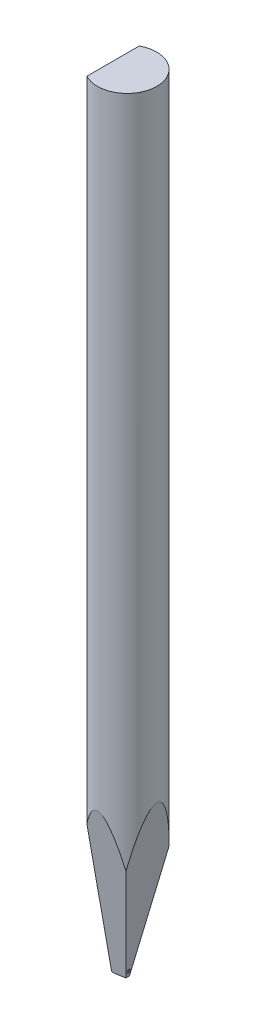
ISO-10303-21;
HEADER;
FILE_DESCRIPTION(('STEP AP214'),'2;1');
FILE_NAME('part.step','',(''),(''),'','','');
FILE_SCHEMA(('AUTOMOTIVE_DESIGN { 1 0 10303 214 1 1 1 1 }'));
ENDSEC;
DATA;
#1=APPLICATION_CONTEXT('core data for automotive mechanical design processes');
#2=APPLICATION_PROTOCOL_DEFINITION('international standard','automotive_design',2000,#1);
#3=PRODUCT_CONTEXT('',#1,'mechanical');
#4=PRODUCT('Part','Part','',(#3));
#5=PRODUCT_RELATED_PRODUCT_CATEGORY('part','',(#4));
#6=PRODUCT_DEFINITION_FORMATION('','',#4);
#7=PRODUCT_DEFINITION_CONTEXT('part definition',#1,'design');
#8=PRODUCT_DEFINITION('design','',#6,#7);
#9=PRODUCT_DEFINITION_SHAPE('','',#8);
#10=(LENGTH_UNIT() NAMED_UNIT(*) SI_UNIT(.MILLI.,.METRE.));
#11=(NAMED_UNIT(*) PLANE_ANGLE_UNIT() SI_UNIT($,.RADIAN.));
#12=(NAMED_UNIT(*) SI_UNIT($,.STERADIAN.) SOLID_ANGLE_UNIT());
#13=UNCERTAINTY_MEASURE_WITH_UNIT(LENGTH_MEASURE(1.E-05),#10,'distance_accuracy_value','');
#14=(GEOMETRIC_REPRESENTATION_CONTEXT(3) GLOBAL_UNCERTAINTY_ASSIGNED_CONTEXT((#13)) GLOBAL_UNIT_ASSIGNED_CONTEXT((#10,
#11,#12)) REPRESENTATION_CONTEXT('',''));
#15=CARTESIAN_POINT('',(0.,0.,0.));
#16=DIRECTION('',(0.,0.,1.));
#17=DIRECTION('',(1.,0.,0.));
#18=AXIS2_PLACEMENT_3D('',#15,#16,#17);
#19=CARTESIAN_POINT('',(26.8738719491216,0.,0.0381));
#20=DIRECTION('',(0.,-0.173648177666931,0.984807753012208));
#21=DIRECTION('',(0.,-0.984807753012208,-0.173648177666931));
#22=AXIS2_PLACEMENT_3D('',#19,#20,#21);
#23=PLANE('',#22);
#24=CARTESIAN_POINT('',(-0.35189,0.02413,0.0423547700444948));
#25=DIRECTION('',(0.,-0.173648177666931,0.984807753012208));
#26=DIRECTION('',(0.,-0.984807753012208,-0.173648177666931));
#27=AXIS2_PLACEMENT_3D('',#24,#25,#26);
#28=ELLIPSE('',#27,0.024502244144803,0.02413);
#29=CARTESIAN_POINT('',(-0.35189,0.,0.0380999999999996));
#30=VERTEX_POINT('',#29);
#31=CARTESIAN_POINT('',(-0.37592,0.0219354613240977,0.0419678136657259));
#32=VERTEX_POINT('',#31);
#33=EDGE_CURVE('E69',#30,#32,#28,.F.);
#34=ORIENTED_EDGE('',*,*,#33,.F.);
#35=DIRECTION('',(-1.,0.,0.));
#36=VECTOR('',#35,1.);
#37=CARTESIAN_POINT('',(26.8738719491216,0.,0.0381));
#38=LINE('',#37,#36);
#39=CARTESIAN_POINT('',(-0.279399999999996,0.,0.0381000000000001));
#40=VERTEX_POINT('',#39);
#41=EDGE_CURVE('E381',#40,#30,#38,.T.);
#42=ORIENTED_EDGE('',*,*,#41,.F.);
#43=DIRECTION('',(-0.984346441568213,-0.173566836012845,-0.0306045161452665));
#44=VECTOR('',#43,1.);
#45=CARTESIAN_POINT('',(26.0304347628768,4.6391337266767,0.856104443127717));
#46=LINE('',#45,#44);
#47=CARTESIAN_POINT('',(0.0142086463569767,0.0517711261220242,0.0472286463569738));
#48=VERTEX_POINT('',#47);
#49=EDGE_CURVE('E378',#48,#40,#46,.T.);
#50=ORIENTED_EDGE('',*,*,#49,.F.);
#51=DIRECTION('',(-0.171087869746036,-0.970287525247814,-0.171087869746036));
#52=VECTOR('',#51,1.);
#53=CARTESIAN_POINT('',(0.791557999082992,4.46033837772866,0.824577999082991));
#54=LINE('',#53,#52);
#55=CARTESIAN_POINT('',(0.543614713880756,3.05418213206493,0.576634713880755));
#56=VERTEX_POINT('',#55);
#57=EDGE_CURVE('E375',#56,#48,#54,.T.);
#58=ORIENTED_EDGE('',*,*,#57,.F.);
#59=CARTESIAN_POINT('',(0.,-0.216075837327433,0.));
#60=DIRECTION('',(0.,-0.173648177666931,0.984807753012208));
#61=DIRECTION('',(0.,-0.984807753012208,-0.173648177666931));
#62=AXIS2_PLACEMENT_3D('',#59,#60,#61);
#63=ELLIPSE('',#62,4.56371043248163,0.792479999999998);
#64=CARTESIAN_POINT('',(-0.37592,3.74046620982329,0.69764511322018));
#65=VERTEX_POINT('',#64);
#66=EDGE_CURVE('E386',#56,#65,#63,.T.);
#67=ORIENTED_EDGE('',*,*,#66,.T.);
#68=DIRECTION('',(0.,0.984807753012208,0.173648177666931));
#69=VECTOR('',#68,1.);
#70=CARTESIAN_POINT('',(-0.37592,20.2532840805181,3.60930043134861));
#71=LINE('',#70,#69);
#72=EDGE_CURVE('E54',#32,#65,#71,.T.);
#73=ORIENTED_EDGE('',*,*,#72,.F.);
#74=EDGE_LOOP('',(#34,#42,#50,#58,#67,#73));
#75=FACE_BOUND('',#74,.T.);
#76=ADVANCED_FACE('F46',(#75),#23,.T.);
#77=CARTESIAN_POINT('',(26.8738719491216,0.,-0.0381));
#78=DIRECTION('',(0.,-0.173648177666931,-0.984807753012208));
#79=DIRECTION('',(0.,0.984807753012208,-0.173648177666931));
#80=AXIS2_PLACEMENT_3D('',#77,#78,#79);
#81=PLANE('',#80);
#82=CARTESIAN_POINT('',(-0.35189,0.02413,-0.0423547700444948));
#83=DIRECTION('',(0.,-0.173648177666931,-0.984807753012208));
#84=DIRECTION('',(0.,0.984807753012208,-0.173648177666931));
#85=AXIS2_PLACEMENT_3D('',#82,#83,#84);
#86=ELLIPSE('',#85,0.024502244144803,0.02413);
#87=CARTESIAN_POINT('',(-0.37592,0.0219354613240977,-0.0419678136657255));
#88=VERTEX_POINT('',#87);
#89=CARTESIAN_POINT('',(-0.35189,0.,-0.0380999999999996));
#90=VERTEX_POINT('',#89);
#91=EDGE_CURVE('E182',#88,#90,#86,.F.);
#92=ORIENTED_EDGE('',*,*,#91,.F.);
#93=DIRECTION('',(0.,-0.984807753012208,0.173648177666931));
#94=VECTOR('',#93,1.);
#95=CARTESIAN_POINT('',(-0.37592,20.5277483982937,-3.65769589581418));
#96=LINE('',#95,#94);
#97=CARTESIAN_POINT('',(-0.37592,3.74046620982329,-0.69764511322018));
#98=VERTEX_POINT('',#97);
#99=EDGE_CURVE('E178',#98,#88,#96,.T.);
#100=ORIENTED_EDGE('',*,*,#99,.F.);
#101=CARTESIAN_POINT('',(0.,-0.216075837327433,0.));
#102=DIRECTION('',(0.,-0.173648177666931,-0.984807753012208));
#103=DIRECTION('',(0.,-0.984807753012208,0.173648177666931));
#104=AXIS2_PLACEMENT_3D('',#101,#102,#103);
#105=ELLIPSE('',#104,4.56371043248163,0.792479999999998);
#106=CARTESIAN_POINT('',(0.543614713880756,3.05418213206493,-0.576634713880755));
#107=VERTEX_POINT('',#106);
#108=EDGE_CURVE('E389',#98,#107,#105,.T.);
#109=ORIENTED_EDGE('',*,*,#108,.T.);
#110=DIRECTION('',(0.171087869746036,0.970287525247814,-0.171087869746036));
#111=VECTOR('',#110,1.);
#112=CARTESIAN_POINT('',(0.791557999082992,4.46033837772866,-0.824577999082991));
#113=LINE('',#112,#111);
#114=CARTESIAN_POINT('',(0.0142086463569767,0.0517711261220242,-0.0472286463569738));
#115=VERTEX_POINT('',#114);
#116=EDGE_CURVE('E218',#115,#107,#113,.T.);
#117=ORIENTED_EDGE('',*,*,#116,.F.);
#118=DIRECTION('',(0.984346441568213,0.173566836012845,-0.0306045161452665));
#119=VECTOR('',#118,1.);
#120=CARTESIAN_POINT('',(26.0304347628768,4.6391337266767,-0.856104443127717));
#121=LINE('',#120,#119);
#122=CARTESIAN_POINT('',(-0.279399999999996,0.,-0.0381000000000001));
#123=VERTEX_POINT('',#122);
#124=EDGE_CURVE('E225',#123,#115,#121,.T.);
#125=ORIENTED_EDGE('',*,*,#124,.F.);
#126=DIRECTION('',(-1.,0.,0.));
#127=VECTOR('',#126,1.);
#128=CARTESIAN_POINT('',(26.8738719491216,0.,-0.0381));
#129=LINE('',#128,#127);
#130=EDGE_CURVE('E383',#123,#90,#129,.T.);
#131=ORIENTED_EDGE('',*,*,#130,.T.);
#132=EDGE_LOOP('',(#92,#100,#109,#117,#125,#131));
#133=FACE_BOUND('',#132,.T.);
#134=ADVANCED_FACE('F283',(#133),#81,.T.);
#135=CARTESIAN_POINT('',(0.,0.,0.));
#136=DIRECTION('',(0.,1.,0.));
#137=DIRECTION('',(0.,0.,1.));
#138=AXIS2_PLACEMENT_3D('',#135,#136,#137);
#139=PLANE('',#138);
#140=ORIENTED_EDGE('',*,*,#41,.T.);
#141=DIRECTION('',(0.,0.,-1.));
#142=VECTOR('',#141,1.);
#143=CARTESIAN_POINT('',(-0.35189,0.,26.4549627497491));
#144=LINE('',#143,#142);
#145=CARTESIAN_POINT('',(-0.351890000000001,0.,0.0355373141922684));
#146=VERTEX_POINT('',#145);
#147=EDGE_CURVE('E702',#30,#146,#144,.T.);
#148=ORIENTED_EDGE('',*,*,#147,.T.);
#149=DIRECTION('',(-1.,0.,0.));
#150=VECTOR('',#149,1.);
#151=CARTESIAN_POINT('',(26.7532219491216,0.,0.0355373141922684));
#152=LINE('',#151,#150);
#153=CARTESIAN_POINT('',(-0.279399999999999,0.,0.0355373141922684));
#154=VERTEX_POINT('',#153);
#155=EDGE_CURVE('E321',#154,#146,#152,.T.);
#156=ORIENTED_EDGE('',*,*,#155,.F.);
#157=DIRECTION('',(0.,0.,-1.));
#158=VECTOR('',#157,1.);
#159=CARTESIAN_POINT('',(-0.2794,0.,27.2760283406468));
#160=LINE('',#159,#158);
#161=EDGE_CURVE('E370',#40,#154,#160,.T.);
#162=ORIENTED_EDGE('',*,*,#161,.F.);
#163=EDGE_LOOP('',(#140,#148,#156,#162));
#164=FACE_BOUND('',#163,.T.);
#165=ADVANCED_FACE('F286',(#164),#139,.F.);
#166=DIRECTION('',(-1.,0.,0.));
#167=VECTOR('',#166,1.);
#168=CARTESIAN_POINT('',(26.7532219491216,0.,-0.0355373141922684));
#169=LINE('',#168,#167);
#170=CARTESIAN_POINT('',(-0.279399999999999,0.,-0.0355373141922684));
#171=VERTEX_POINT('',#170);
#172=CARTESIAN_POINT('',(-0.35189000000066,0.,-0.0355373141922684));
#173=VERTEX_POINT('',#172);
#174=EDGE_CURVE('E329',#171,#173,#169,.T.);
#175=ORIENTED_EDGE('',*,*,#174,.T.);
#176=EDGE_CURVE('E701',#173,#90,#144,.T.);
#177=ORIENTED_EDGE('',*,*,#176,.T.);
#178=ORIENTED_EDGE('',*,*,#130,.F.);
#179=EDGE_CURVE('E369',#171,#123,#160,.T.);
#180=ORIENTED_EDGE('',*,*,#179,.F.);
#181=EDGE_LOOP('',(#175,#177,#178,#180));
#182=FACE_BOUND('',#181,.T.);
#183=ADVANCED_FACE('F537',(#182),#139,.F.);
#184=CARTESIAN_POINT('',(0.,21.0312,0.));
#185=DIRECTION('',(0.,-1.,0.));
#186=DIRECTION('',(0.,0.,-1.));
#187=AXIS2_PLACEMENT_3D('',#184,#185,#186);
#188=CYLINDRICAL_SURFACE('',#187,0.792479999999998);
#189=ORIENTED_EDGE('',*,*,#66,.F.);
#190=CARTESIAN_POINT('',(0.,-0.0288101116436568,0.));
#191=DIRECTION('',(-0.984807753012208,0.173648177666931,0.));
#192=DIRECTION('',(-0.173648177666931,-0.984807753012208,0.));
#193=AXIS2_PLACEMENT_3D('',#190,#191,#192);
#194=ELLIPSE('',#193,4.56371043248164,0.792479999999998);
#195=EDGE_CURVE('E372',#56,#107,#194,.T.);
#196=ORIENTED_EDGE('',*,*,#195,.T.);
#197=ORIENTED_EDGE('',*,*,#108,.F.);
#198=DIRECTION('',(0.,-1.,0.));
#199=VECTOR('',#198,1.);
#200=CARTESIAN_POINT('',(-0.37592,21.0312,-0.69764511322018));
#201=LINE('',#200,#199);
#202=CARTESIAN_POINT('',(-0.37592,21.0312,-0.69764511322018));
#203=VERTEX_POINT('',#202);
#204=EDGE_CURVE('E395',#203,#98,#201,.T.);
#205=ORIENTED_EDGE('',*,*,#204,.F.);
#206=CARTESIAN_POINT('',(0.,21.0312,0.));
#207=DIRECTION('',(0.,1.,0.));
#208=DIRECTION('',(0.,0.,1.));
#209=AXIS2_PLACEMENT_3D('',#206,#207,#208);
#210=CIRCLE('',#209,0.792479999999998);
#211=CARTESIAN_POINT('',(-0.37592,21.0312,0.69764511322018));
#212=VERTEX_POINT('',#211);
#213=EDGE_CURVE('E396',#212,#203,#210,.T.);
#214=ORIENTED_EDGE('',*,*,#213,.F.);
#215=DIRECTION('',(0.,-1.,0.));
#216=VECTOR('',#215,1.);
#217=CARTESIAN_POINT('',(-0.37592,21.0312,0.69764511322018));
#218=LINE('',#217,#216);
#219=EDGE_CURVE('E393',#65,#212,#218,.F.);
#220=ORIENTED_EDGE('',*,*,#219,.F.);
#221=EDGE_LOOP('',(#189,#196,#197,#205,#214,#220));
#222=FACE_BOUND('',#221,.T.);
#223=ADVANCED_FACE('F291',(#222),#188,.T.);
#224=CARTESIAN_POINT('',(-0.37592,21.0312,-0.80247998));
#225=DIRECTION('',(-1.,0.,0.));
#226=DIRECTION('',(0.,0.,1.));
#227=AXIS2_PLACEMENT_3D('',#224,#225,#226);
#228=PLANE('',#227);
#229=ORIENTED_EDGE('',*,*,#99,.T.);
#230=DIRECTION('',(0.,0.,-1.));
#231=VECTOR('',#230,1.);
#232=CARTESIAN_POINT('',(-0.37592,0.0219354613241028,26.4549627497491));
#233=LINE('',#232,#231);
#234=CARTESIAN_POINT('',(-0.375920000000275,0.0219355396613273,-0.010224843180339));
#235=VERTEX_POINT('',#234);
#236=EDGE_CURVE('E175',#235,#88,#233,.T.);
#237=ORIENTED_EDGE('',*,*,#236,.F.);
#238=CARTESIAN_POINT('',(-0.37592,0.,0.0355373141922684));
#239=CARTESIAN_POINT('',(-0.37592,0.0123359586796348,0.0261254448351633));
#240=CARTESIAN_POINT('',(-0.37592,0.0241300000000007,0.013381408455424));
#241=CARTESIAN_POINT('',(-0.37592,0.0241300000000007,-0.0133814084554238));
#242=CARTESIAN_POINT('',(-0.37592,0.0123359586796344,-0.026125444835163));
#243=CARTESIAN_POINT('',(-0.37592,0.,-0.0355373141922685));
#244=(BOUNDED_CURVE() B_SPLINE_CURVE(3,(#238,#239,#240,#241,#242,#243),.UNSPECIFIED.,.F.,
.F.) B_SPLINE_CURVE_WITH_KNOTS((4,2,4),(1.35718974229686,1.5707963267949,1.78440291129293),
.UNSPECIFIED.) CURVE() GEOMETRIC_REPRESENTATION_ITEM() RATIONAL_B_SPLINE_CURVE((1.,1.,1.,1.,1.,1.)) REPRESENTATION_ITEM(''));
#245=CARTESIAN_POINT('',(-0.375959614183627,0.0231506993995728,0.0104909042535853));
#246=VERTEX_POINT('',#245);
#247=EDGE_CURVE('E163',#235,#246,#244,.F.);
#248=ORIENTED_EDGE('',*,*,#247,.T.);
#249=EDGE_CURVE('E402',#32,#246,#233,.T.);
#250=ORIENTED_EDGE('',*,*,#249,.F.);
#251=ORIENTED_EDGE('',*,*,#72,.T.);
#252=ORIENTED_EDGE('',*,*,#219,.T.);
#253=DIRECTION('',(0.,0.,-1.));
#254=VECTOR('',#253,1.);
#255=CARTESIAN_POINT('',(-0.37592,21.0312,-0.80247998));
#256=LINE('',#255,#254);
#257=EDGE_CURVE('E391',#212,#203,#256,.T.);
#258=ORIENTED_EDGE('',*,*,#257,.T.);
#259=ORIENTED_EDGE('',*,*,#204,.T.);
#260=EDGE_LOOP('',(#229,#237,#248,#250,#251,#252,#258,#259));
#261=FACE_BOUND('',#260,.T.);
#262=ADVANCED_FACE('F176',(#261),#228,.T.);
#263=CARTESIAN_POINT('',(0.,21.0312,0.));
#264=DIRECTION('',(0.,1.,0.));
#265=DIRECTION('',(0.,0.,1.));
#266=AXIS2_PLACEMENT_3D('',#263,#264,#265);
#267=PLANE('',#266);
#268=ORIENTED_EDGE('',*,*,#213,.T.);
#269=ORIENTED_EDGE('',*,*,#257,.F.);
#270=EDGE_LOOP('',(#268,#269));
#271=FACE_BOUND('',#270,.T.);
#272=ADVANCED_FACE('F279',(#271),#267,.T.);
#273=CARTESIAN_POINT('',(-0.2794,0.,27.2760283406468));
#274=DIRECTION('',(-0.173648177666931,0.984807753012208,0.));
#275=DIRECTION('',(-0.984807753012208,-0.173648177666931,0.));
#276=AXIS2_PLACEMENT_3D('',#273,#274,#275);
#277=PLANE('',#276);
#278=ORIENTED_EDGE('',*,*,#161,.T.);
#279=CARTESIAN_POINT('',(-1.20852610050796,-0.16383,0.));
#280=DIRECTION('',(-0.173648177666931,0.984807753012208,0.));
#281=DIRECTION('',(-0.984807753012208,-0.173648177666931,0.));
#282=AXIS2_PLACEMENT_3D('',#279,#280,#281);
#283=ELLIPSE('',#282,0.965400283794194,0.16764);
#284=CARTESIAN_POINT('',(-0.2666733614567,0.00224404974890385,0.0228599999999998));
#285=VERTEX_POINT('',#284);
#286=EDGE_CURVE('E337',#154,#285,#283,.T.);
#287=ORIENTED_EDGE('',*,*,#286,.T.);
#288=DIRECTION('',(-0.984807753012208,-0.173648177666931,0.));
#289=VECTOR('',#288,1.);
#290=CARTESIAN_POINT('',(-0.2794,0.,0.0228599999999995));
#291=LINE('',#290,#289);
#292=CARTESIAN_POINT('',(-0.1143,0.0291115845149677,0.0228599999999998));
#293=VERTEX_POINT('',#292);
#294=EDGE_CURVE('E238',#293,#285,#291,.T.);
#295=ORIENTED_EDGE('',*,*,#294,.F.);
#296=DIRECTION('',(0.,0.,1.));
#297=VECTOR('',#296,1.);
#298=CARTESIAN_POINT('',(-0.1143,0.0291115845149677,27.2760283406468));
#299=LINE('',#298,#297);
#300=CARTESIAN_POINT('',(-0.1143,0.0291115845149677,-0.0228599999999998));
#301=VERTEX_POINT('',#300);
#302=EDGE_CURVE('E236',#301,#293,#299,.T.);
#303=ORIENTED_EDGE('',*,*,#302,.F.);
#304=DIRECTION('',(-0.984807753012208,-0.173648177666931,0.));
#305=VECTOR('',#304,1.);
#306=CARTESIAN_POINT('',(-0.2794,0.,-0.0228599999999995));
#307=LINE('',#306,#305);
#308=CARTESIAN_POINT('',(-0.2666733614567,0.00224404974890385,-0.0228599999999998));
#309=VERTEX_POINT('',#308);
#310=EDGE_CURVE('E228',#301,#309,#307,.T.);
#311=ORIENTED_EDGE('',*,*,#310,.T.);
#312=EDGE_CURVE('E332',#309,#171,#283,.T.);
#313=ORIENTED_EDGE('',*,*,#312,.T.);
#314=ORIENTED_EDGE('',*,*,#179,.T.);
#315=ORIENTED_EDGE('',*,*,#124,.T.);
#316=DIRECTION('',(0.,0.,-1.));
#317=VECTOR('',#316,1.);
#318=CARTESIAN_POINT('',(0.0142086463569737,0.0517711261220249,27.2760283406468));
#319=LINE('',#318,#317);
#320=EDGE_CURVE('E232',#48,#115,#319,.T.);
#321=ORIENTED_EDGE('',*,*,#320,.F.);
#322=ORIENTED_EDGE('',*,*,#49,.T.);
#323=EDGE_LOOP('',(#278,#287,#295,#303,#311,#313,#314,#315,#321,#322));
#324=FACE_BOUND('',#323,.T.);
#325=ADVANCED_FACE('F275',(#324),#277,.F.);
#326=CARTESIAN_POINT('',(0.0142086463569737,0.0517711261220249,27.2760283406468));
#327=DIRECTION('',(-0.984807753012208,0.173648177666931,0.));
#328=DIRECTION('',(-0.173648177666931,-0.984807753012208,0.));
#329=AXIS2_PLACEMENT_3D('',#326,#327,#328);
#330=PLANE('',#329);
#331=CARTESIAN_POINT('',(0.0401727059586961,0.199020625304743,0.));
#332=DIRECTION('',(-0.984807753012208,0.173648177666931,0.));
#333=DIRECTION('',(0.173648177666931,0.984807753012208,0.));
#334=AXIS2_PLACEMENT_3D('',#331,#332,#333);
#335=ELLIPSE('',#334,0.0515734368592615,0.0370444608655554);
#336=CARTESIAN_POINT('',(0.0491283392853274,0.249810545773229,0.));
#337=VERTEX_POINT('',#336);
#338=EDGE_CURVE('E229',#337,#337,#335,.F.);
#339=ORIENTED_EDGE('',*,*,#338,.F.);
#340=EDGE_LOOP('',(#339));
#341=FACE_BOUND('',#340,.T.);
#342=ORIENTED_EDGE('',*,*,#195,.F.);
#343=ORIENTED_EDGE('',*,*,#57,.T.);
#344=ORIENTED_EDGE('',*,*,#320,.T.);
#345=ORIENTED_EDGE('',*,*,#116,.T.);
#346=EDGE_LOOP('',(#342,#343,#344,#345));
#347=FACE_BOUND('',#346,.T.);
#348=ADVANCED_FACE('F270',(#341,#347),#330,.F.);
#349=CARTESIAN_POINT('',(-0.224144167394209,0.0939800000000001,0.));
#350=DIRECTION('',(-0.500000000000004,-0.866025403784436,0.));
#351=DIRECTION('',(0.866025403784436,-0.500000000000004,0.));
#352=AXIS2_PLACEMENT_3D('',#349,#350,#351);
#353=CYLINDRICAL_SURFACE('',#352,0.02286);
#354=DIRECTION('',(-0.500000000000004,-0.866025403784436,0.));
#355=VECTOR('',#354,1.);
#356=CARTESIAN_POINT('',(-0.208802659269487,0.120552271536749,0.02286));
#357=LINE('',#356,#355);
#358=CARTESIAN_POINT('',(-0.224144167394209,0.0939800000000001,0.02286));
#359=VERTEX_POINT('',#358);
#360=CARTESIAN_POINT('',(-0.277107942966049,0.00224404974889894,0.02286));
#361=VERTEX_POINT('',#360);
#362=EDGE_CURVE('E361',#359,#361,#357,.T.);
#363=ORIENTED_EDGE('',*,*,#362,.T.);
#364=CARTESIAN_POINT('',(-0.277107942966052,0.00224404974889966,-0.02286));
#365=CARTESIAN_POINT('',(-0.283458830952595,0.00662990732762152,-0.022859999999999));
#366=CARTESIAN_POINT('',(-0.288238014169759,0.00906804178727436,-0.0196229390810593));
#367=CARTESIAN_POINT('',(-0.295009573337047,0.0127605615105413,-0.011151028810743));
#368=CARTESIAN_POINT('',(-0.296750516375033,0.0139697273321268,-0.00556059566064805));
#369=CARTESIAN_POINT('',(-0.296718155170427,0.0139702741342318,0.0056735396289807));
#370=CARTESIAN_POINT('',(-0.294957682369533,0.0127624560377921,0.0112285482507281));
#371=CARTESIAN_POINT('',(-0.288162967316092,0.00907275932146746,0.0196621664995063));
#372=CARTESIAN_POINT('',(-0.283434228325602,0.00661851153547161,0.0228599999999999));
#373=CARTESIAN_POINT('',(-0.277107942966049,0.00224404974889968,0.02286));
#374=(BOUNDED_CURVE() B_SPLINE_CURVE(3,(#364,#365,#366,#367,#368,#369,#370,#371,#372,#373),
.UNSPECIFIED.,.F.,.F.) B_SPLINE_CURVE_WITH_KNOTS((4,2,2,2,4),(0.,1.89475864318584E-05,
3.78951728637168E-05,5.68427592955753E-05,7.57903457274337E-05),
.UNSPECIFIED.) CURVE() GEOMETRIC_REPRESENTATION_ITEM() RATIONAL_B_SPLINE_CURVE((1.,1.,1.,1.,1.,
1.,1.,1.,1.,1.)) REPRESENTATION_ITEM(''));
#375=CARTESIAN_POINT('',(-0.277107942966048,0.0022440497488995,-0.02286));
#376=VERTEX_POINT('',#375);
#377=EDGE_CURVE('E247',#361,#376,#374,.F.);
#378=ORIENTED_EDGE('',*,*,#377,.T.);
#379=DIRECTION('',(0.500000000000004,0.866025403784436,0.));
#380=VECTOR('',#379,1.);
#381=CARTESIAN_POINT('',(-0.224144167394209,0.0939800000000001,-0.02286));
#382=LINE('',#381,#380);
#383=CARTESIAN_POINT('',(-0.224144167394209,0.0939800000000001,-0.02286));
#384=VERTEX_POINT('',#383);
#385=EDGE_CURVE('E366',#376,#384,#382,.T.);
#386=ORIENTED_EDGE('',*,*,#385,.T.);
#387=CARTESIAN_POINT('',(-0.224144167394209,0.0939800000000001,0.));
#388=DIRECTION('',(0.,-1.,0.));
#389=DIRECTION('',(-1.,0.,0.));
#390=AXIS2_PLACEMENT_3D('',#387,#388,#389);
#391=ELLIPSE('',#390,0.0263964543073498,0.02286);
#392=EDGE_CURVE('E233',#384,#359,#391,.F.);
#393=ORIENTED_EDGE('',*,*,#392,.T.);
#394=EDGE_LOOP('',(#363,#378,#386,#393));
#395=FACE_BOUND('',#394,.T.);
#396=ADVANCED_FACE('F256',(#395),#353,.F.);
#397=CARTESIAN_POINT('',(-0.1143,0.0939800000000001,0.02286));
#398=DIRECTION('',(-1.,0.,0.));
#399=DIRECTION('',(0.,0.,1.));
#400=AXIS2_PLACEMENT_3D('',#397,#398,#399);
#401=PLANE('',#400);
#402=ORIENTED_EDGE('',*,*,#302,.T.);
#403=DIRECTION('',(0.,1.,0.));
#404=VECTOR('',#403,1.);
#405=CARTESIAN_POINT('',(-0.1143,0.0939800000000001,0.02286));
#406=LINE('',#405,#404);
#407=CARTESIAN_POINT('',(-0.1143,0.0939800000000001,0.02286));
#408=VERTEX_POINT('',#407);
#409=EDGE_CURVE('E358',#293,#408,#406,.T.);
#410=ORIENTED_EDGE('',*,*,#409,.T.);
#411=CARTESIAN_POINT('',(-0.1143,0.09398,0.));
#412=DIRECTION('',(1.,0.,0.));
#413=DIRECTION('',(0.,1.,0.));
#414=AXIS2_PLACEMENT_3D('',#411,#412,#413);
#415=ELLIPSE('',#414,0.0263964543073496,0.02286);
#416=CARTESIAN_POINT('',(-0.1143,0.0939800000000001,-0.0228599999999995));
#417=VERTEX_POINT('',#416);
#418=EDGE_CURVE('E349',#417,#408,#415,.F.);
#419=ORIENTED_EDGE('',*,*,#418,.F.);
#420=DIRECTION('',(0.,1.,0.));
#421=VECTOR('',#420,1.);
#422=CARTESIAN_POINT('',(-0.1143,0.0939800000000001,-0.02286));
#423=LINE('',#422,#421);
#424=EDGE_CURVE('E359',#301,#417,#423,.T.);
#425=ORIENTED_EDGE('',*,*,#424,.F.);
#426=EDGE_LOOP('',(#402,#410,#419,#425));
#427=FACE_BOUND('',#426,.T.);
#428=ADVANCED_FACE('F269',(#427),#401,.T.);
#429=CARTESIAN_POINT('',(0.,0.,0.02286));
#430=DIRECTION('',(0.,0.,-1.));
#431=DIRECTION('',(-1.,0.,0.));
#432=AXIS2_PLACEMENT_3D('',#429,#430,#431);
#433=PLANE('',#432);
#434=DIRECTION('',(-1.,0.,0.));
#435=VECTOR('',#434,1.);
#436=CARTESIAN_POINT('',(26.7532219491216,0.00224404974889968,0.02286));
#437=LINE('',#436,#435);
#438=EDGE_CURVE('E253',#361,#285,#437,.F.);
#439=ORIENTED_EDGE('',*,*,#438,.F.);
#440=ORIENTED_EDGE('',*,*,#362,.F.);
#441=DIRECTION('',(-1.,0.,0.));
#442=VECTOR('',#441,1.);
#443=CARTESIAN_POINT('',(-0.250540621701558,0.0939800000000001,0.02286));
#444=LINE('',#443,#442);
#445=EDGE_CURVE('E355',#408,#359,#444,.T.);
#446=ORIENTED_EDGE('',*,*,#445,.F.);
#447=ORIENTED_EDGE('',*,*,#409,.F.);
#448=ORIENTED_EDGE('',*,*,#294,.T.);
#449=EDGE_LOOP('',(#439,#440,#446,#447,#448));
#450=FACE_BOUND('',#449,.T.);
#451=ADVANCED_FACE('F435',(#450),#433,.T.);
#452=CARTESIAN_POINT('',(0.,0.,-0.02286));
#453=DIRECTION('',(0.,0.,-1.));
#454=DIRECTION('',(-1.,0.,0.));
#455=AXIS2_PLACEMENT_3D('',#452,#453,#454);
#456=PLANE('',#455);
#457=ORIENTED_EDGE('',*,*,#385,.F.);
#458=DIRECTION('',(-1.,0.,0.));
#459=VECTOR('',#458,1.);
#460=CARTESIAN_POINT('',(26.7532219491216,0.00224404974889968,-0.02286));
#461=LINE('',#460,#459);
#462=EDGE_CURVE('E241',#376,#309,#461,.F.);
#463=ORIENTED_EDGE('',*,*,#462,.T.);
#464=ORIENTED_EDGE('',*,*,#310,.F.);
#465=ORIENTED_EDGE('',*,*,#424,.T.);
#466=DIRECTION('',(-1.,0.,0.));
#467=VECTOR('',#466,1.);
#468=CARTESIAN_POINT('',(-0.250540621701558,0.0939800000000001,-0.02286));
#469=LINE('',#468,#467);
#470=EDGE_CURVE('E354',#417,#384,#469,.T.);
#471=ORIENTED_EDGE('',*,*,#470,.T.);
#472=EDGE_LOOP('',(#457,#463,#464,#465,#471));
#473=FACE_BOUND('',#472,.T.);
#474=ADVANCED_FACE('F441',(#473),#456,.F.);
#475=CARTESIAN_POINT('',(0.0122322627883964,0.167033435982052,0.));
#476=DIRECTION('',(0.866025403784441,0.499999999999995,0.));
#477=DIRECTION('',(-0.499999999999995,0.866025403784441,0.));
#478=AXIS2_PLACEMENT_3D('',#475,#476,#477);
#479=CONICAL_SURFACE('',#478,0.02286,0.392699081698725);
#480=CARTESIAN_POINT('',(0.0122322627883964,0.167033435982052,0.));
#481=DIRECTION('',(0.866025403784441,0.499999999999995,0.));
#482=DIRECTION('',(-0.499999999999995,0.866025403784441,0.));
#483=AXIS2_PLACEMENT_3D('',#480,#481,#482);
#484=CIRCLE('',#483,0.02286);
#485=CARTESIAN_POINT('',(0.00080226278839655,0.186830776712565,0.));
#486=VERTEX_POINT('',#485);
#487=EDGE_CURVE('E341',#486,#486,#484,.T.);
#488=ORIENTED_EDGE('',*,*,#487,.F.);
#489=EDGE_LOOP('',(#488));
#490=FACE_BOUND('',#489,.T.);
#491=ORIENTED_EDGE('',*,*,#338,.T.);
#492=EDGE_LOOP('',(#491));
#493=FACE_BOUND('',#492,.T.);
#494=ADVANCED_FACE('F448',(#490,#493),#479,.F.);
#495=CARTESIAN_POINT('',(-0.250540621701558,0.0939800000000001,0.02286));
#496=DIRECTION('',(0.,-1.,0.));
#497=DIRECTION('',(0.,0.,-1.));
#498=AXIS2_PLACEMENT_3D('',#495,#496,#497);
#499=PLANE('',#498);
#500=ORIENTED_EDGE('',*,*,#470,.F.);
#501=CARTESIAN_POINT('',(-0.1143,0.0939800000000001,0.));
#502=DIRECTION('',(0.,1.,0.));
#503=DIRECTION('',(1.,0.,0.));
#504=AXIS2_PLACEMENT_3D('',#501,#502,#503);
#505=ELLIPSE('',#504,0.0457200000000004,0.02286);
#506=EDGE_CURVE('E345',#408,#417,#505,.F.);
#507=ORIENTED_EDGE('',*,*,#506,.F.);
#508=ORIENTED_EDGE('',*,*,#445,.T.);
#509=ORIENTED_EDGE('',*,*,#392,.F.);
#510=EDGE_LOOP('',(#500,#507,#508,#509));
#511=FACE_BOUND('',#510,.T.);
#512=ADVANCED_FACE('F271',(#511),#499,.T.);
#513=CARTESIAN_POINT('',(-0.361071138175361,-0.0484933830537733,0.));
#514=DIRECTION('',(0.866025403784441,0.499999999999995,0.));
#515=DIRECTION('',(-0.499999999999995,0.866025403784441,0.));
#516=AXIS2_PLACEMENT_3D('',#513,#514,#515);
#517=CYLINDRICAL_SURFACE('',#516,0.02286);
#518=ORIENTED_EDGE('',*,*,#418,.T.);
#519=ORIENTED_EDGE('',*,*,#506,.T.);
#520=EDGE_LOOP('',(#518,#519));
#521=FACE_BOUND('',#520,.T.);
#522=ORIENTED_EDGE('',*,*,#487,.T.);
#523=EDGE_LOOP('',(#522));
#524=FACE_BOUND('',#523,.T.);
#525=ADVANCED_FACE('F462',(#521,#524),#517,.F.);
#526=CARTESIAN_POINT('',(26.7532219491216,-0.16383,0.));
#527=DIRECTION('',(-1.,0.,0.));
#528=DIRECTION('',(0.,0.,1.));
#529=AXIS2_PLACEMENT_3D('',#526,#527,#528);
#530=CYLINDRICAL_SURFACE('',#529,0.16764);
#531=ORIENTED_EDGE('',*,*,#155,.T.);
#532=CARTESIAN_POINT('',(-0.35189,0.,0.0355373141922684));
#533=CARTESIAN_POINT('',(-0.352249668342652,-3.1644969071811E-07,0.0355385995095474));
#534=CARTESIAN_POINT('',(-0.352607439601553,8.02818367780947E-06,0.035500318254268));
#535=CARTESIAN_POINT('',(-0.353303655703916,3.90463941921952E-05,0.0353569439486636));
#536=CARTESIAN_POINT('',(-0.353642303507041,6.15137569732996E-05,0.0352528122895414));
#537=CARTESIAN_POINT('',(-0.354293614243823,0.000117763185050622,0.0349902438494591));
#538=CARTESIAN_POINT('',(-0.354606422572586,0.000151475665794418,0.0348321409041775));
#539=CARTESIAN_POINT('',(-0.355206981302935,0.000227153868779776,0.034473962319524));
#540=CARTESIAN_POINT('',(-0.355494629178868,0.000269151278077996,0.0342737253292812));
#541=CARTESIAN_POINT('',(-0.356269110683659,0.000395250314370916,0.0336659216504462));
#542=CARTESIAN_POINT('',(-0.356726660395176,0.000485716625125136,0.0332226300592517));
#543=CARTESIAN_POINT('',(-0.357571422670499,0.000674415716683586,0.0322754539316978));
#544=CARTESIAN_POINT('',(-0.357958419343308,0.000772671057965837,0.0317713910024807));
#545=CARTESIAN_POINT('',(-0.359056529172298,0.00107580067057533,0.0301733027579081));
#546=CARTESIAN_POINT('',(-0.359677833698047,0.00128358971705124,0.0290188780669844));
#547=CARTESIAN_POINT('',(-0.360765248765377,0.00168436492622039,0.0266393127268761));
#548=CARTESIAN_POINT('',(-0.361230981402638,0.00187731417930728,0.0254140082426635));
#549=CARTESIAN_POINT('',(-0.362621271092907,0.00248985705969784,0.0212073753235609));
#550=CARTESIAN_POINT('',(-0.36329249987197,0.00285492843747878,0.0181353476658935));
#551=CARTESIAN_POINT('',(-0.364276679349108,0.00341576574656757,0.011914135200303));
#552=CARTESIAN_POINT('',(-0.364587661352639,0.00361059994835304,0.00876462159404117));
#553=CARTESIAN_POINT('',(-0.365008078841964,0.00387434920441847,0.000878520987366361));
#554=CARTESIAN_POINT('',(-0.364941234586346,0.00383299736486849,-0.00387100770457962));
#555=CARTESIAN_POINT('',(-0.36416743131961,0.00334801222560449,-0.0132807766905089));
#556=CARTESIAN_POINT('',(-0.36346602607949,0.0029078691555828,-0.0179414340867087));
#557=CARTESIAN_POINT('',(-0.361935925669933,0.00218943506643746,-0.0232698617756675));
#558=CARTESIAN_POINT('',(-0.361669336734846,0.00206830252842352,-0.0241173628313344));
#559=CARTESIAN_POINT('',(-0.361079500183904,0.00181590566569847,-0.0257937219690029));
#560=CARTESIAN_POINT('',(-0.360756111149149,0.00168461652098595,-0.0266225275511856));
#561=CARTESIAN_POINT('',(-0.359985799278323,0.00139436321864785,-0.0283722163485569));
#562=CARTESIAN_POINT('',(-0.359527578320922,0.00123422218073195,-0.029287993525864));
#563=CARTESIAN_POINT('',(-0.35848646022634,0.00091265778824753,-0.0310452521133025));
#564=CARTESIAN_POINT('',(-0.357904183819933,0.000751244535880948,-0.0318870749858256));
#565=CARTESIAN_POINT('',(-0.356960612388882,0.000537175877259494,-0.0329652175868421));
#566=CARTESIAN_POINT('',(-0.356673376179315,0.000476848448842134,-0.0332642866227097));
#567=CARTESIAN_POINT('',(-0.356064305294942,0.000361768756805535,-0.0338277165810855));
#568=CARTESIAN_POINT('',(-0.355742427249446,0.000307023653007552,-0.0340920330529995));
#569=CARTESIAN_POINT('',(-0.355056183372287,0.000206073174392215,-0.0345745305900033));
#570=CARTESIAN_POINT('',(-0.354691240587474,0.000160011974018704,-0.0347919401869191));
#571=CARTESIAN_POINT('',(-0.35392579307815,8.30042228159121E-05,-0.0351529694942786));
#572=CARTESIAN_POINT('',(-0.35352549751998,5.19749993899241E-05,-0.0352969930442584));
#573=CARTESIAN_POINT('',(-0.35291414394059,2.09077143094453E-05,-0.0354408230247105));
#574=CARTESIAN_POINT('',(-0.352711684747334,1.31384500590778E-05,-0.0354767046674955));
#575=CARTESIAN_POINT('',(-0.352302905346337,2.655768193882E-06,-0.0355250720129181));
#576=CARTESIAN_POINT('',(-0.352096571370407,-3.34685002867517E-08,-0.0355374458198908));
#577=CARTESIAN_POINT('',(-0.351890000000659,-1.69125610184529E-13,-0.0355373141950322));
#578=B_SPLINE_CURVE_WITH_KNOTS('',3,(#532,#533,#534,#535,#536,#537,#538,#539,#540,#541,#542,
#543,#544,#545,#546,#547,#548,#549,#550,#551,#552,#553,#554,#555,#556,#557,#558,#559,#560,#561,
#562,#563,#564,#565,#566,#567,#568,#569,#570,#571,#572,#573,#574,#575,#576,#577),.UNSPECIFIED.,
.F.,.F.,(4,2,2,2,2,2,2,2,2,2,2,2,2,2,2,2,2,2,2,2,2,2,4),(0.,0.00107387793307747,
0.00213242859854409,0.00318454687300627,0.00424077001276429,0.0061599933015218,
0.00808499425946905,0.0120448307551851,0.0160142174212676,0.0254592668811319,0.0349556921836507,
0.0491587337563986,0.0632386581819932,0.0659271174774281,0.0686223678254726,0.0717265046140596,
0.07481545959662,0.0760704044702183,0.0773269391934501,0.0786027851340055,0.0798715322106305,
0.0804875134550958,0.0811064194522882),.UNSPECIFIED.);
#579=CARTESIAN_POINT('',(-0.362934641039202,0.00268736316362965,0.0193619822582402));
#580=VERTEX_POINT('',#579);
#581=EDGE_CURVE('E705',#146,#580,#578,.T.);
#582=ORIENTED_EDGE('',*,*,#581,.T.);
#583=CARTESIAN_POINT('',(-0.37592,0.,-0.0355373141922685));
#584=CARTESIAN_POINT('',(-0.365756940225437,0.00252981156072762,-0.0238746706466237));
#585=CARTESIAN_POINT('',(-0.355600000000001,0.00381000000000001,-0.0119362651530878));
#586=CARTESIAN_POINT('',(-0.355600000000001,0.00381,0.0119362651530881));
#587=CARTESIAN_POINT('',(-0.365756940225437,0.00252981156072763,0.0238746706466237));
#588=CARTESIAN_POINT('',(-0.37592,0.,0.0355373141922684));
#589=(BOUNDED_CURVE() B_SPLINE_CURVE(3,(#583,#584,#585,#586,#587,#588),.UNSPECIFIED.,.F.,
.F.) B_SPLINE_CURVE_WITH_KNOTS((4,2,4),(1.35718974229686,1.5707963267949,1.78440291129293),
.UNSPECIFIED.) CURVE() GEOMETRIC_REPRESENTATION_ITEM() RATIONAL_B_SPLINE_CURVE((1.,1.,1.,1.,1.,1.)) REPRESENTATION_ITEM(''));
#590=CARTESIAN_POINT('',(-0.362934637535099,0.00268735671838089,-0.0193620377734083));
#591=VERTEX_POINT('',#590);
#592=EDGE_CURVE('E171',#580,#591,#589,.F.);
#593=ORIENTED_EDGE('',*,*,#592,.T.);
#594=EDGE_CURVE('E183',#591,#173,#578,.T.);
#595=ORIENTED_EDGE('',*,*,#594,.T.);
#596=ORIENTED_EDGE('',*,*,#174,.F.);
#597=ORIENTED_EDGE('',*,*,#312,.F.);
#598=ORIENTED_EDGE('',*,*,#462,.F.);
#599=CARTESIAN_POINT('',(-0.277107942966049,0.00224404974889968,0.02286));
#600=CARTESIAN_POINT('',(-0.283472069272186,0.0016442867352262,0.0272171772777935));
#601=CARTESIAN_POINT('',(-0.292608347157434,0.0016234757173974,0.0273466306211965));
#602=CARTESIAN_POINT('',(-0.308350693361825,0.00283426151014642,0.0185934065888038));
#603=CARTESIAN_POINT('',(-0.314304668214107,0.00380460465811883,0.00955459901852536));
#604=CARTESIAN_POINT('',(-0.31435916834997,0.00381534135033899,-0.00936432404484779));
#605=CARTESIAN_POINT('',(-0.308433634839991,0.00284880217824659,-0.0184711274946257));
#606=CARTESIAN_POINT('',(-0.292708773944077,0.0016329051680215,-0.0272952864036251));
#607=CARTESIAN_POINT('',(-0.283500112457096,0.0016422284077341,-0.0272321306803446));
#608=CARTESIAN_POINT('',(-0.277107942966052,0.00224404974889966,-0.02286));
#609=(BOUNDED_CURVE() B_SPLINE_CURVE(3,(#599,#600,#601,#602,#603,#604,#605,#606,#607,#608),
.UNSPECIFIED.,.F.,.F.) B_SPLINE_CURVE_WITH_KNOTS((4,2,2,2,4),(0.,1.89475864318584E-05,
3.78951728637168E-05,5.68427592955753E-05,7.57903457274337E-05),
.UNSPECIFIED.) CURVE() GEOMETRIC_REPRESENTATION_ITEM() RATIONAL_B_SPLINE_CURVE((1.,1.,1.,1.,1.,
1.,1.,1.,1.,1.)) REPRESENTATION_ITEM(''));
#610=EDGE_CURVE('E664',#376,#361,#609,.F.);
#611=ORIENTED_EDGE('',*,*,#610,.T.);
#612=ORIENTED_EDGE('',*,*,#438,.T.);
#613=ORIENTED_EDGE('',*,*,#286,.F.);
#614=EDGE_LOOP('',(#531,#582,#593,#595,#596,#597,#598,#611,#612,#613));
#615=FACE_BOUND('',#614,.T.);
#616=ADVANCED_FACE('F200',(#615),#530,.F.);
#617=CARTESIAN_POINT('',(-0.277107942966049,0.00224404974889968,0.02286));
#618=CARTESIAN_POINT('',(-0.283434228325602,0.00661851153547161,0.0228599999999999));
#619=CARTESIAN_POINT('',(-0.288162967316092,0.00907275932146746,0.0196621664995063));
#620=CARTESIAN_POINT('',(-0.294957682369533,0.0127624560377921,0.0112285482507281));
#621=CARTESIAN_POINT('',(-0.296718155170427,0.0139702741342318,0.0056735396289807));
#622=CARTESIAN_POINT('',(-0.296750516375033,0.0139697273321268,-0.00556059566064805));
#623=CARTESIAN_POINT('',(-0.295009573337047,0.0127605615105413,-0.011151028810743));
#624=CARTESIAN_POINT('',(-0.288238014169759,0.00906804178727436,-0.0196229390810593));
#625=CARTESIAN_POINT('',(-0.283458830952595,0.00662990732762152,-0.022859999999999));
#626=CARTESIAN_POINT('',(-0.277107942966052,0.00224404974889966,-0.02286));
#627=CARTESIAN_POINT('',(-0.277107942966049,0.00224404974889968,0.02286));
#628=CARTESIAN_POINT('',(-0.282799904250856,0.00224508121370906,0.0228596717317687));
#629=CARTESIAN_POINT('',(-0.289309195326958,0.00262640016305242,0.0212566041515952));
#630=CARTESIAN_POINT('',(-0.299268415177658,0.00344454680683125,0.0130540565646547));
#631=CARTESIAN_POINT('',(-0.30257985893891,0.00380792934344847,0.00658152497028285));
#632=CARTESIAN_POINT('',(-0.302620530520814,0.00381205022825936,-0.00645031113070643));
#633=CARTESIAN_POINT('',(-0.299333051151248,0.00345069171773801,-0.0129671346731368));
#634=CARTESIAN_POINT('',(-0.289394582117606,0.00263120354491061,-0.0212193327036071));
#635=CARTESIAN_POINT('',(-0.282825806150449,0.00224499062083318,-0.0228603688544052));
#636=CARTESIAN_POINT('',(-0.277107942966052,0.00224404974889966,-0.02286));
#637=CARTESIAN_POINT('',(-0.277107942966049,0.00224404974889968,0.02286));
#638=CARTESIAN_POINT('',(-0.283472069272186,0.0016442867352262,0.0272171772777935));
#639=CARTESIAN_POINT('',(-0.292608347157434,0.0016234757173974,0.0273466306211965));
#640=CARTESIAN_POINT('',(-0.308350693361825,0.00283426151014642,0.0185934065888038));
#641=CARTESIAN_POINT('',(-0.314304668214107,0.00380460465811883,0.00955459901852536));
#642=CARTESIAN_POINT('',(-0.31435916834997,0.00381534135033899,-0.00936432404484779));
#643=CARTESIAN_POINT('',(-0.308433634839991,0.00284880217824659,-0.0184711274946257));
#644=CARTESIAN_POINT('',(-0.292708773944077,0.0016329051680215,-0.0272952864036251));
#645=CARTESIAN_POINT('',(-0.283500112457096,0.0016422284077341,-0.0272321306803446));
#646=CARTESIAN_POINT('',(-0.277107942966052,0.00224404974889966,-0.02286));
#647=(BOUNDED_SURFACE() B_SPLINE_SURFACE(2,3,((#617,#618,#619,#620,#621,#622,#623,#624,#625,
#626),(#627,#628,#629,#630,#631,#632,#633,#634,#635,#636),(#637,#638,#639,#640,#641,#642,#643,
#644,#645,#646)),.UNSPECIFIED.,.F.,.F.,.F.) B_SPLINE_SURFACE_WITH_KNOTS((3,3),(4,2,2,2,4),(0.,
1.),(0.,1.89475864318584E-05,3.78951728637168E-05,5.68427592955753E-05,7.57903457274337E-05),
.UNSPECIFIED.) GEOMETRIC_REPRESENTATION_ITEM() RATIONAL_B_SPLINE_SURFACE(((1.,1.,1.,1.,1.,1.,1.,
1.,1.,1.),(0.753778361444412,0.816999421397932,0.841371347447862,0.866090023191699,
0.866013332606022,0.866037357056243,0.866147684701979,0.841596576328909,0.817236348950093,
0.753778361444431),(1.,1.,1.,1.,1.,1.,1.,1.,1.,1.))) REPRESENTATION_ITEM('') SURFACE());
#648=ORIENTED_EDGE('',*,*,#377,.F.);
#649=ORIENTED_EDGE('',*,*,#610,.F.);
#650=EDGE_LOOP('',(#648,#649));
#651=FACE_BOUND('',#650,.T.);
#652=ADVANCED_FACE('F474',(#651),#647,.T.);
#653=CARTESIAN_POINT('',(-0.37592,0.,0.0355373141922684));
#654=CARTESIAN_POINT('',(-0.365756940225437,0.00252981156072763,0.0238746706466237));
#655=CARTESIAN_POINT('',(-0.355600000000001,0.00381,0.0119362651530881));
#656=CARTESIAN_POINT('',(-0.355600000000001,0.00381000000000001,-0.0119362651530878));
#657=CARTESIAN_POINT('',(-0.365756940225437,0.00252981156072762,-0.0238746706466237));
#658=CARTESIAN_POINT('',(-0.37592,0.,-0.0355373141922685));
#659=CARTESIAN_POINT('',(-0.37592,0.,0.0355373141922684));
#660=CARTESIAN_POINT('',(-0.375919999999993,0.00253036332383113,0.0238721239843854));
#661=CARTESIAN_POINT('',(-0.375920000000001,0.00381000000000123,0.0119362651530879));
#662=CARTESIAN_POINT('',(-0.375920000000001,0.00381000000000106,-0.0119362651530877));
#663=CARTESIAN_POINT('',(-0.375919999999994,0.00253036332383165,-0.0238721239843857));
#664=CARTESIAN_POINT('',(-0.37592,0.,-0.0355373141922685));
#665=CARTESIAN_POINT('',(-0.37592,0.,0.0355373141922684));
#666=CARTESIAN_POINT('',(-0.37592,0.0123359586796348,0.0261254448351633));
#667=CARTESIAN_POINT('',(-0.37592,0.0241300000000007,0.013381408455424));
#668=CARTESIAN_POINT('',(-0.37592,0.0241300000000007,-0.0133814084554238));
#669=CARTESIAN_POINT('',(-0.37592,0.0123359586796344,-0.026125444835163));
#670=CARTESIAN_POINT('',(-0.37592,0.,-0.0355373141922685));
#671=(BOUNDED_SURFACE() B_SPLINE_SURFACE(2,3,((#653,#654,#655,#656,#657,#658),(#659,#660,#661,
#662,#663,#664),(#665,#666,#667,#668,#669,#670)),.UNSPECIFIED.,.F.,.F.,
.F.) B_SPLINE_SURFACE_WITH_KNOTS((3,3),(4,2,4),(0.,1.),(1.35718974229686,1.5707963267949,
1.78440291129293),.UNSPECIFIED.) GEOMETRIC_REPRESENTATION_ITEM() RATIONAL_B_SPLINE_SURFACE(((1.,
1.,1.,1.,1.,1.),(0.707106781186548,0.707106781186548,0.707106781186556,0.707106781186556,
0.707106781186548,0.707106781186548),(1.,1.,1.,1.,1.,1.))) REPRESENTATION_ITEM('') SURFACE());
#672=CARTESIAN_POINT('',(-0.375920000000007,0.0219354613242672,0.0102620121258682));
#673=CARTESIAN_POINT('',(-0.375919489550987,0.0219291894204862,0.00998037827218387));
#674=CARTESIAN_POINT('',(-0.375918753370209,0.0219210128195279,0.00970061206674087));
#675=CARTESIAN_POINT('',(-0.375913665284554,0.0218677362793524,0.00911874106627232));
#676=CARTESIAN_POINT('',(-0.375908975824181,0.0218191952353375,0.00881704526415537));
#677=CARTESIAN_POINT('',(-0.375884289715329,0.0215639524164656,0.00796333042616456));
#678=CARTESIAN_POINT('',(-0.375854631576574,0.0212574877507691,0.00741790355266151));
#679=CARTESIAN_POINT('',(-0.375719817658284,0.0203165609400866,0.00671918309248708));
#680=CARTESIAN_POINT('',(-0.375607518839695,0.0196527864488169,0.00660976542578931));
#681=CARTESIAN_POINT('',(-0.375351610086801,0.0184512745317775,0.00659307822304932));
#682=CARTESIAN_POINT('',(-0.375211447194507,0.0179076266521747,0.00666951059020496));
#683=CARTESIAN_POINT('',(-0.374898121120566,0.0168394282464735,0.00687554085534375));
#684=CARTESIAN_POINT('',(-0.374725395377549,0.0163147234946183,0.00700445766414141));
#685=CARTESIAN_POINT('',(-0.373684118460341,0.0134760005173032,0.00778122590529022));
#686=CARTESIAN_POINT('',(-0.37250171337751,0.0113477211839396,0.00866190010279237));
#687=CARTESIAN_POINT('',(-0.369559270681379,0.0075257825980039,0.0107691620000465));
#688=CARTESIAN_POINT('',(-0.367774439441488,0.00585760242503519,0.012010207030023));
#689=CARTESIAN_POINT('',(-0.365373620284829,0.00409419127698243,0.0145695354626358));
#690=CARTESIAN_POINT('',(-0.364643630529891,0.00363504115081286,0.0154903952706546));
#691=CARTESIAN_POINT('',(-0.363564314702521,0.00300394857611211,0.0173977741705294));
#692=CARTESIAN_POINT('',(-0.363172938590499,0.00279796747435655,0.0183506228851619));
#693=CARTESIAN_POINT('',(-0.36295018680107,0.00268404075529754,0.0193884040138287));
#694=B_SPLINE_CURVE_WITH_KNOTS('',3,(#672,#673,#674,#675,#676,#677,#678,#679,#680,#681,#682,
#683,#684,#685,#686,#687,#688,#689,#690,#691,#692,#693),.UNSPECIFIED.,.F.,.F.,(4,2,2,2,2,2,2,2,
2,2,4),(0.,0.000840070868183808,0.00176011904497845,0.00346705553043875,0.00534198489938351,
0.00705850469320322,0.00875342534303152,0.016399140428269,0.0244084194661605,0.0281277042561796,
0.0312561386344786),.UNSPECIFIED.);
#695=EDGE_CURVE('E12',#246,#580,#694,.T.);
#696=CARTESIAN_POINT('',(-0.362950186800526,0.00268404075502565,-0.0193884040161041));
#697=CARTESIAN_POINT('',(-0.363178503286617,0.00279899348610528,-0.0183331327703362));
#698=CARTESIAN_POINT('',(-0.363577759859133,0.00300999845553832,-0.0173667359227681));
#699=CARTESIAN_POINT('',(-0.364731817147154,0.00368894630919396,-0.0153434645724507));
#700=CARTESIAN_POINT('',(-0.365556583424589,0.00421413085485313,-0.0143433069387344));
#701=CARTESIAN_POINT('',(-0.367755584768071,0.00587208630201482,-0.0121039949582562));
#702=CARTESIAN_POINT('',(-0.369172596331694,0.00718058380865491,-0.0110591888037762));
#703=CARTESIAN_POINT('',(-0.371779498049371,0.0103011635912821,-0.009170380001205));
#704=CARTESIAN_POINT('',(-0.372948374898782,0.0121406631302467,-0.00834405951634961));
#705=CARTESIAN_POINT('',(-0.374201903112629,0.0149052861023017,-0.00740485183350359));
#706=CARTESIAN_POINT('',(-0.374508352537819,0.0156861049029269,-0.00716821414322803));
#707=CARTESIAN_POINT('',(-0.375042334883838,0.0172745194181087,-0.00676542079320031));
#708=CARTESIAN_POINT('',(-0.375270337836087,0.0180819227181071,-0.00659884395903425));
#709=CARTESIAN_POINT('',(-0.375595205381879,0.0195890777999514,-0.00660264000843524));
#710=CARTESIAN_POINT('',(-0.375710827857877,0.0202600806448851,-0.00669497387210431));
#711=CARTESIAN_POINT('',(-0.375853721731946,0.0212431402418182,-0.00739381362325024));
#712=CARTESIAN_POINT('',(-0.375885184790831,0.021571706693783,-0.00797394894747864));
#713=CARTESIAN_POINT('',(-0.375909645613525,0.0218263136598437,-0.00885317258791848));
#714=CARTESIAN_POINT('',(-0.375914026859554,0.021871650878762,-0.00914703051346212));
#715=CARTESIAN_POINT('',(-0.375918789023793,0.0219213721489019,-0.00971407810002102));
#716=CARTESIAN_POINT('',(-0.375919478276248,0.0219289092584991,-0.00998690179187152));
#717=CARTESIAN_POINT('',(-0.37592,0.0219354613241035,-0.0102620121004404));
#718=B_SPLINE_CURVE_WITH_KNOTS('',3,(#696,#697,#698,#699,#700,#701,#702,#703,#704,#705,#706,
#707,#708,#709,#710,#711,#712,#713,#714,#715,#716,#717),.UNSPECIFIED.,.F.,.F.,(4,2,2,2,2,2,2,2,
2,2,4),(0.,0.00317768006405659,0.00728817224018106,0.013767126961843,0.0206713556561194,
0.0232742607498009,0.0258612866084471,0.027758113288453,0.0295585364512217,0.0304544335175293,
0.0312741900978475),.UNSPECIFIED.);
#719=EDGE_CURVE('E61',#591,#235,#718,.T.);
#720=CARTESIAN_POINT('',(-0.37592,0.,0.0355373141922684));
#721=CARTESIAN_POINT('',(-0.365756940225437,0.00252981156072763,0.0238746706466237));
#722=CARTESIAN_POINT('',(-0.355600000000001,0.00381,0.0119362651530881));
#723=CARTESIAN_POINT('',(-0.355600000000001,0.00381000000000001,-0.0119362651530878));
#724=CARTESIAN_POINT('',(-0.365756940225437,0.00252981156072762,-0.0238746706466237));
#725=CARTESIAN_POINT('',(-0.37592,0.,-0.0355373141922685));
#726=CARTESIAN_POINT('',(-0.37592,0.,0.0355373141922684));
#727=CARTESIAN_POINT('',(-0.375919999999993,0.00253036332383113,0.0238721239843854));
#728=CARTESIAN_POINT('',(-0.375920000000001,0.00381000000000122,0.0119362651530879));
#729=CARTESIAN_POINT('',(-0.375920000000001,0.00381000000000106,-0.0119362651530877));
#730=CARTESIAN_POINT('',(-0.375919999999994,0.00253036332383165,-0.0238721239843857));
#731=CARTESIAN_POINT('',(-0.37592,0.,-0.0355373141922685));
#732=CARTESIAN_POINT('',(-0.37592,0.,0.0355373141922684));
#733=CARTESIAN_POINT('',(-0.37592,0.0123359586796348,0.0261254448351633));
#734=CARTESIAN_POINT('',(-0.37592,0.0241300000000007,0.013381408455424));
#735=CARTESIAN_POINT('',(-0.37592,0.0241300000000007,-0.0133814084554238));
#736=CARTESIAN_POINT('',(-0.37592,0.0123359586796344,-0.026125444835163));
#737=CARTESIAN_POINT('',(-0.37592,0.,-0.0355373141922685));
#738=CARTESIAN_POINT('',(-0.37592,0.,0.0355373141922684));
#739=CARTESIAN_POINT('',(-0.37592,0.0127658420637537,0.0262242318192973));
#740=CARTESIAN_POINT('',(-0.37592,0.0250208414072107,0.0134447644344139));
#741=CARTESIAN_POINT('',(-0.37592,0.0250208414072107,-0.0134447644344137));
#742=CARTESIAN_POINT('',(-0.37592,0.0127658420637533,-0.026224231819297));
#743=CARTESIAN_POINT('',(-0.37592,0.,-0.0355373141922685));
#744=CARTESIAN_POINT('',(-0.37592,0.,0.0355373141922684));
#745=CARTESIAN_POINT('',(-0.375920000000001,0.0131957254478727,0.0263230188034313));
#746=CARTESIAN_POINT('',(-0.37592,0.0259116828144208,0.0135081204134037));
#747=CARTESIAN_POINT('',(-0.37592,0.0259116828144208,-0.0135081204134035));
#748=CARTESIAN_POINT('',(-0.37592,0.0131957254478722,-0.026323018803431));
#749=CARTESIAN_POINT('',(-0.37592,0.,-0.0355373141922685));
#750=(BOUNDED_SURFACE() B_SPLINE_SURFACE(2,3,((#720,#721,#722,#723,#724,#725),(#726,#727,#728,
#729,#730,#731),(#732,#733,#734,#735,#736,#737),(#738,#739,#740,#741,#742,#743),(#744,#745,#746,
#747,#748,#749)),.UNSPECIFIED.,.F.,.F.,.F.) B_SPLINE_SURFACE_WITH_KNOTS((3,2,3),(4,2,4),
(-0.414213562373095,1.,1.062),(1.35718974229686,1.5707963267949,1.78440291129293),
.UNSPECIFIED.) GEOMETRIC_REPRESENTATION_ITEM() RATIONAL_B_SPLINE_SURFACE(((2.,2.,2.,2.,2.,2.),
(1.,1.,1.00000000000001,1.00000000000001,1.,1.),(1.,1.,1.,1.,1.,1.),(1.,1.,0.999999999999999,
0.999999999999999,1.,1.),(1.,1.,0.999999999999999,0.999999999999999,1.,1.))) REPRESENTATION_ITEM('') SURFACE());
#751=ORIENTED_EDGE('',*,*,#695,.F.);
#752=ORIENTED_EDGE('',*,*,#247,.F.);
#753=ORIENTED_EDGE('',*,*,#719,.F.);
#754=ORIENTED_EDGE('',*,*,#592,.F.);
#755=EDGE_LOOP('',(#751,#752,#753,#754));
#756=FACE_BOUND('',#755,.T.);
#757=ADVANCED_FACE('F49',(#756),#750,.T.);
#758=CARTESIAN_POINT('',(-0.35189,0.02413,26.4549627497491));
#759=DIRECTION('',(0.,0.,-1.));
#760=DIRECTION('',(-1.,0.,0.));
#761=AXIS2_PLACEMENT_3D('',#758,#759,#760);
#762=CYLINDRICAL_SURFACE('',#761,0.02413);
#763=ORIENTED_EDGE('',*,*,#236,.T.);
#764=ORIENTED_EDGE('',*,*,#91,.T.);
#765=ORIENTED_EDGE('',*,*,#176,.F.);
#766=ORIENTED_EDGE('',*,*,#594,.F.);
#767=ORIENTED_EDGE('',*,*,#719,.T.);
#768=EDGE_LOOP('',(#763,#764,#765,#766,#767));
#769=FACE_BOUND('',#768,.T.);
#770=ADVANCED_FACE('F186',(#769),#762,.T.);
#771=ORIENTED_EDGE('',*,*,#147,.F.);
#772=ORIENTED_EDGE('',*,*,#33,.T.);
#773=ORIENTED_EDGE('',*,*,#249,.T.);
#774=ORIENTED_EDGE('',*,*,#695,.T.);
#775=ORIENTED_EDGE('',*,*,#581,.F.);
#776=EDGE_LOOP('',(#771,#772,#773,#774,#775));
#777=FACE_BOUND('',#776,.T.);
#778=ADVANCED_FACE('F199',(#777),#762,.T.);
#779=CLOSED_SHELL('',(#76,#134,#165,#183,#223,#262,#272,#325,#348,#396,#428,#451,#474,#494,#512,
#525,#616,#652,#757,#770,#778));
#780=MANIFOLD_SOLID_BREP('B2',#779);
#781=ADVANCED_BREP_SHAPE_REPRESENTATION('',(#18,#780),#14);
#782=SHAPE_DEFINITION_REPRESENTATION(#9,#781);
ENDSEC;
END-ISO-10303-21;
